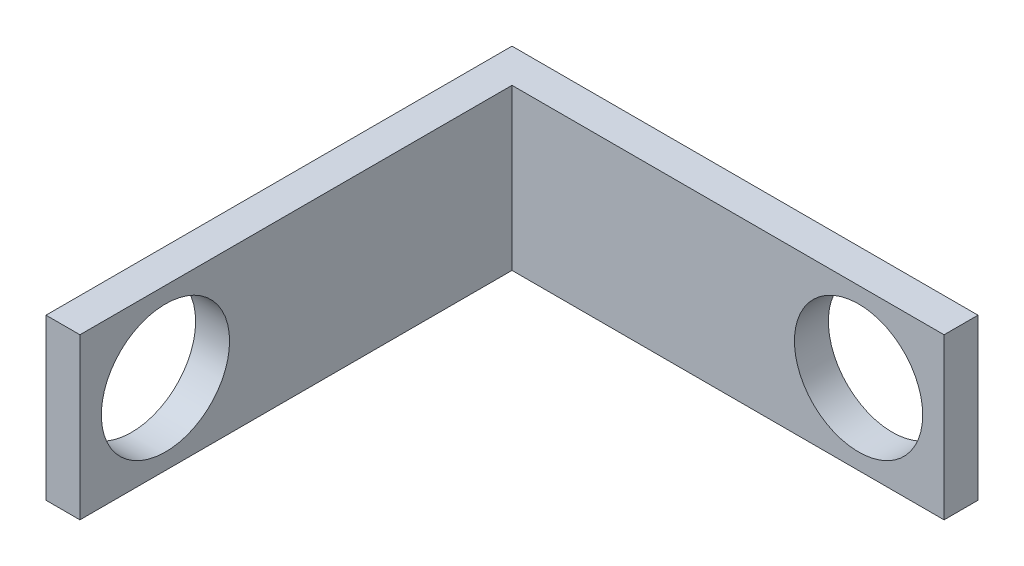
ISO-10303-21;
HEADER;
FILE_DESCRIPTION(('STEP AP214'),'2;1');
FILE_NAME('part.step','',(''),(''),'','','');
FILE_SCHEMA(('AUTOMOTIVE_DESIGN { 1 0 10303 214 1 1 1 1 }'));
ENDSEC;
DATA;
#1=APPLICATION_CONTEXT('core data for automotive mechanical design processes');
#2=APPLICATION_PROTOCOL_DEFINITION('international standard','automotive_design',2000,#1);
#3=PRODUCT_CONTEXT('',#1,'mechanical');
#4=PRODUCT('Part','Part','',(#3));
#5=PRODUCT_RELATED_PRODUCT_CATEGORY('part','',(#4));
#6=PRODUCT_DEFINITION_FORMATION('','',#4);
#7=PRODUCT_DEFINITION_CONTEXT('part definition',#1,'design');
#8=PRODUCT_DEFINITION('design','',#6,#7);
#9=PRODUCT_DEFINITION_SHAPE('','',#8);
#10=(LENGTH_UNIT() NAMED_UNIT(*) SI_UNIT(.MILLI.,.METRE.));
#11=(NAMED_UNIT(*) PLANE_ANGLE_UNIT() SI_UNIT($,.RADIAN.));
#12=(NAMED_UNIT(*) SI_UNIT($,.STERADIAN.) SOLID_ANGLE_UNIT());
#13=UNCERTAINTY_MEASURE_WITH_UNIT(LENGTH_MEASURE(1.E-05),#10,'distance_accuracy_value','');
#14=(GEOMETRIC_REPRESENTATION_CONTEXT(3) GLOBAL_UNCERTAINTY_ASSIGNED_CONTEXT((#13)) GLOBAL_UNIT_ASSIGNED_CONTEXT((#10,
#11,#12)) REPRESENTATION_CONTEXT('',''));
#15=CARTESIAN_POINT('',(0.,0.,0.));
#16=DIRECTION('',(0.,0.,1.));
#17=DIRECTION('',(1.,0.,0.));
#18=AXIS2_PLACEMENT_3D('',#15,#16,#17);
#19=CARTESIAN_POINT('',(0.,3.75,-17.8));
#20=DIRECTION('',(0.,0.,-1.));
#21=DIRECTION('',(-1.,0.,0.));
#22=AXIS2_PLACEMENT_3D('',#19,#20,#21);
#23=PLANE('',#22);
#24=CARTESIAN_POINT('',(0.,0.,-17.8));
#25=DIRECTION('',(0.,0.,1.));
#26=DIRECTION('',(1.,0.,0.));
#27=AXIS2_PLACEMENT_3D('',#24,#25,#26);
#28=CIRCLE('',#27,3.);
#29=CARTESIAN_POINT('',(3.,0.,-17.8));
#30=VERTEX_POINT('',#29);
#31=EDGE_CURVE('E134',#30,#30,#28,.T.);
#32=ORIENTED_EDGE('',*,*,#31,.T.);
#33=EDGE_LOOP('',(#32));
#34=FACE_BOUND('',#33,.T.);
#35=DIRECTION('',(1.,0.,0.));
#36=VECTOR('',#35,1.);
#37=CARTESIAN_POINT('',(0.,-3.75,-17.8));
#38=LINE('',#37,#36);
#39=CARTESIAN_POINT('',(-17.8,-3.75,-17.8));
#40=VERTEX_POINT('',#39);
#41=CARTESIAN_POINT('',(4.,-3.75,-17.8));
#42=VERTEX_POINT('',#41);
#43=EDGE_CURVE('E129',#40,#42,#38,.T.);
#44=ORIENTED_EDGE('',*,*,#43,.F.);
#45=DIRECTION('',(0.,-1.,0.));
#46=VECTOR('',#45,1.);
#47=CARTESIAN_POINT('',(-17.8,3.75,-17.8));
#48=LINE('',#47,#46);
#49=CARTESIAN_POINT('',(-17.8,3.75,-17.8));
#50=VERTEX_POINT('',#49);
#51=EDGE_CURVE('E11',#50,#40,#48,.T.);
#52=ORIENTED_EDGE('',*,*,#51,.F.);
#53=DIRECTION('',(1.,0.,0.));
#54=VECTOR('',#53,1.);
#55=CARTESIAN_POINT('',(0.,3.75,-17.8));
#56=LINE('',#55,#54);
#57=CARTESIAN_POINT('',(4.,3.75,-17.8));
#58=VERTEX_POINT('',#57);
#59=EDGE_CURVE('E149',#50,#58,#56,.T.);
#60=ORIENTED_EDGE('',*,*,#59,.T.);
#61=DIRECTION('',(0.,-1.,0.));
#62=VECTOR('',#61,1.);
#63=CARTESIAN_POINT('',(4.,3.75,-17.8));
#64=LINE('',#63,#62);
#65=EDGE_CURVE('E86',#58,#42,#64,.T.);
#66=ORIENTED_EDGE('',*,*,#65,.T.);
#67=EDGE_LOOP('',(#44,#52,#60,#66));
#68=FACE_BOUND('',#67,.T.);
#69=ADVANCED_FACE('F41',(#34,#68),#23,.T.);
#70=CARTESIAN_POINT('',(-17.8,3.75,0.));
#71=DIRECTION('',(-1.,0.,0.));
#72=DIRECTION('',(0.,0.,1.));
#73=AXIS2_PLACEMENT_3D('',#70,#71,#72);
#74=PLANE('',#73);
#75=CARTESIAN_POINT('',(-17.8,0.,0.));
#76=DIRECTION('',(1.,0.,0.));
#77=DIRECTION('',(0.,0.,-1.));
#78=AXIS2_PLACEMENT_3D('',#75,#76,#77);
#79=CIRCLE('',#78,3.);
#80=CARTESIAN_POINT('',(-17.8,0.,-3.));
#81=VERTEX_POINT('',#80);
#82=EDGE_CURVE('E176',#81,#81,#79,.T.);
#83=ORIENTED_EDGE('',*,*,#82,.T.);
#84=EDGE_LOOP('',(#83));
#85=FACE_BOUND('',#84,.T.);
#86=DIRECTION('',(0.,0.,-1.));
#87=VECTOR('',#86,1.);
#88=CARTESIAN_POINT('',(-17.8,-3.75,0.));
#89=LINE('',#88,#87);
#90=CARTESIAN_POINT('',(-17.8,-3.75,4.));
#91=VERTEX_POINT('',#90);
#92=EDGE_CURVE('E133',#91,#40,#89,.T.);
#93=ORIENTED_EDGE('',*,*,#92,.F.);
#94=DIRECTION('',(0.,-1.,0.));
#95=VECTOR('',#94,1.);
#96=CARTESIAN_POINT('',(-17.8,3.75,4.));
#97=LINE('',#96,#95);
#98=CARTESIAN_POINT('',(-17.8,3.75,4.));
#99=VERTEX_POINT('',#98);
#100=EDGE_CURVE('E50',#99,#91,#97,.T.);
#101=ORIENTED_EDGE('',*,*,#100,.F.);
#102=DIRECTION('',(0.,0.,-1.));
#103=VECTOR('',#102,1.);
#104=CARTESIAN_POINT('',(-17.8,3.75,0.));
#105=LINE('',#104,#103);
#106=EDGE_CURVE('E123',#99,#50,#105,.T.);
#107=ORIENTED_EDGE('',*,*,#106,.T.);
#108=ORIENTED_EDGE('',*,*,#51,.T.);
#109=EDGE_LOOP('',(#93,#101,#107,#108));
#110=FACE_BOUND('',#109,.T.);
#111=ADVANCED_FACE('F164',(#85,#110),#74,.T.);
#112=CARTESIAN_POINT('',(0.,3.75,4.));
#113=DIRECTION('',(0.,0.,-1.));
#114=DIRECTION('',(-1.,0.,0.));
#115=AXIS2_PLACEMENT_3D('',#112,#113,#114);
#116=PLANE('',#115);
#117=DIRECTION('',(1.,0.,0.));
#118=VECTOR('',#117,1.);
#119=CARTESIAN_POINT('',(0.,-3.75,4.));
#120=LINE('',#119,#118);
#121=CARTESIAN_POINT('',(-16.2125,-3.75,4.));
#122=VERTEX_POINT('',#121);
#123=EDGE_CURVE('E138',#91,#122,#120,.T.);
#124=ORIENTED_EDGE('',*,*,#123,.T.);
#125=DIRECTION('',(0.,-1.,0.));
#126=VECTOR('',#125,1.);
#127=CARTESIAN_POINT('',(-16.2125,3.75,4.));
#128=LINE('',#127,#126);
#129=CARTESIAN_POINT('',(-16.2125,3.75,4.));
#130=VERTEX_POINT('',#129);
#131=EDGE_CURVE('E108',#130,#122,#128,.T.);
#132=ORIENTED_EDGE('',*,*,#131,.F.);
#133=DIRECTION('',(1.,0.,0.));
#134=VECTOR('',#133,1.);
#135=CARTESIAN_POINT('',(0.,3.75,4.));
#136=LINE('',#135,#134);
#137=EDGE_CURVE('E118',#99,#130,#136,.T.);
#138=ORIENTED_EDGE('',*,*,#137,.F.);
#139=ORIENTED_EDGE('',*,*,#100,.T.);
#140=EDGE_LOOP('',(#124,#132,#138,#139));
#141=FACE_BOUND('',#140,.T.);
#142=ADVANCED_FACE('F158',(#141),#116,.F.);
#143=CARTESIAN_POINT('',(-16.2125,3.75,0.));
#144=DIRECTION('',(1.,0.,0.));
#145=DIRECTION('',(0.,0.,-1.));
#146=AXIS2_PLACEMENT_3D('',#143,#144,#145);
#147=PLANE('',#146);
#148=CARTESIAN_POINT('',(-16.2125,0.,0.));
#149=DIRECTION('',(1.,0.,0.));
#150=DIRECTION('',(0.,0.,-1.));
#151=AXIS2_PLACEMENT_3D('',#148,#149,#150);
#152=CIRCLE('',#151,3.);
#153=CARTESIAN_POINT('',(-16.2125,0.,-3.));
#154=VERTEX_POINT('',#153);
#155=EDGE_CURVE('E180',#154,#154,#152,.T.);
#156=ORIENTED_EDGE('',*,*,#155,.F.);
#157=EDGE_LOOP('',(#156));
#158=FACE_BOUND('',#157,.T.);
#159=DIRECTION('',(0.,0.,1.));
#160=VECTOR('',#159,1.);
#161=CARTESIAN_POINT('',(-16.2125,-3.75,0.));
#162=LINE('',#161,#160);
#163=CARTESIAN_POINT('',(-16.2125,-3.75,-16.2125));
#164=VERTEX_POINT('',#163);
#165=EDGE_CURVE('E106',#164,#122,#162,.T.);
#166=ORIENTED_EDGE('',*,*,#165,.F.);
#167=DIRECTION('',(0.,-1.,0.));
#168=VECTOR('',#167,1.);
#169=CARTESIAN_POINT('',(-16.2125,3.75,-16.2125));
#170=LINE('',#169,#168);
#171=CARTESIAN_POINT('',(-16.2125,3.75,-16.2125));
#172=VERTEX_POINT('',#171);
#173=EDGE_CURVE('E100',#172,#164,#170,.T.);
#174=ORIENTED_EDGE('',*,*,#173,.F.);
#175=DIRECTION('',(0.,0.,1.));
#176=VECTOR('',#175,1.);
#177=CARTESIAN_POINT('',(-16.2125,3.75,0.));
#178=LINE('',#177,#176);
#179=EDGE_CURVE('E104',#172,#130,#178,.T.);
#180=ORIENTED_EDGE('',*,*,#179,.T.);
#181=ORIENTED_EDGE('',*,*,#131,.T.);
#182=EDGE_LOOP('',(#166,#174,#180,#181));
#183=FACE_BOUND('',#182,.T.);
#184=ADVANCED_FACE('F102',(#158,#183),#147,.T.);
#185=CARTESIAN_POINT('',(0.,3.75,-16.2125));
#186=DIRECTION('',(0.,0.,-1.));
#187=DIRECTION('',(-1.,0.,0.));
#188=AXIS2_PLACEMENT_3D('',#185,#186,#187);
#189=PLANE('',#188);
#190=CARTESIAN_POINT('',(0.,0.,-16.2125));
#191=DIRECTION('',(0.,0.,1.));
#192=DIRECTION('',(1.,0.,0.));
#193=AXIS2_PLACEMENT_3D('',#190,#191,#192);
#194=CIRCLE('',#193,3.);
#195=CARTESIAN_POINT('',(3.,0.,-16.2125));
#196=VERTEX_POINT('',#195);
#197=EDGE_CURVE('E172',#196,#196,#194,.T.);
#198=ORIENTED_EDGE('',*,*,#197,.F.);
#199=EDGE_LOOP('',(#198));
#200=FACE_BOUND('',#199,.T.);
#201=DIRECTION('',(1.,0.,0.));
#202=VECTOR('',#201,1.);
#203=CARTESIAN_POINT('',(0.,-3.75,-16.2125));
#204=LINE('',#203,#202);
#205=CARTESIAN_POINT('',(4.,-3.75,-16.2125));
#206=VERTEX_POINT('',#205);
#207=EDGE_CURVE('E79',#164,#206,#204,.T.);
#208=ORIENTED_EDGE('',*,*,#207,.T.);
#209=DIRECTION('',(0.,-1.,0.));
#210=VECTOR('',#209,1.);
#211=CARTESIAN_POINT('',(4.,3.75,-16.2125));
#212=LINE('',#211,#210);
#213=CARTESIAN_POINT('',(4.,3.75,-16.2125));
#214=VERTEX_POINT('',#213);
#215=EDGE_CURVE('E109',#214,#206,#212,.T.);
#216=ORIENTED_EDGE('',*,*,#215,.F.);
#217=DIRECTION('',(1.,0.,0.));
#218=VECTOR('',#217,1.);
#219=CARTESIAN_POINT('',(0.,3.75,-16.2125));
#220=LINE('',#219,#218);
#221=EDGE_CURVE('E111',#172,#214,#220,.T.);
#222=ORIENTED_EDGE('',*,*,#221,.F.);
#223=ORIENTED_EDGE('',*,*,#173,.T.);
#224=EDGE_LOOP('',(#208,#216,#222,#223));
#225=FACE_BOUND('',#224,.T.);
#226=ADVANCED_FACE('F112',(#200,#225),#189,.F.);
#227=CARTESIAN_POINT('',(4.,3.75,0.));
#228=DIRECTION('',(-1.,0.,0.));
#229=DIRECTION('',(0.,0.,1.));
#230=AXIS2_PLACEMENT_3D('',#227,#228,#229);
#231=PLANE('',#230);
#232=DIRECTION('',(0.,0.,-1.));
#233=VECTOR('',#232,1.);
#234=CARTESIAN_POINT('',(4.,-3.75,0.));
#235=LINE('',#234,#233);
#236=EDGE_CURVE('E146',#206,#42,#235,.T.);
#237=ORIENTED_EDGE('',*,*,#236,.T.);
#238=ORIENTED_EDGE('',*,*,#65,.F.);
#239=DIRECTION('',(0.,0.,-1.));
#240=VECTOR('',#239,1.);
#241=CARTESIAN_POINT('',(4.,3.75,0.));
#242=LINE('',#241,#240);
#243=EDGE_CURVE('E58',#214,#58,#242,.T.);
#244=ORIENTED_EDGE('',*,*,#243,.F.);
#245=ORIENTED_EDGE('',*,*,#215,.T.);
#246=EDGE_LOOP('',(#237,#238,#244,#245));
#247=FACE_BOUND('',#246,.T.);
#248=ADVANCED_FACE('F167',(#247),#231,.F.);
#249=CARTESIAN_POINT('',(0.,3.75,0.));
#250=DIRECTION('',(0.,1.,0.));
#251=DIRECTION('',(0.,0.,1.));
#252=AXIS2_PLACEMENT_3D('',#249,#250,#251);
#253=PLANE('',#252);
#254=ORIENTED_EDGE('',*,*,#59,.F.);
#255=ORIENTED_EDGE('',*,*,#106,.F.);
#256=ORIENTED_EDGE('',*,*,#137,.T.);
#257=ORIENTED_EDGE('',*,*,#179,.F.);
#258=ORIENTED_EDGE('',*,*,#221,.T.);
#259=ORIENTED_EDGE('',*,*,#243,.T.);
#260=EDGE_LOOP('',(#254,#255,#256,#257,#258,#259));
#261=FACE_BOUND('',#260,.T.);
#262=ADVANCED_FACE('F115',(#261),#253,.T.);
#263=CARTESIAN_POINT('',(0.,-3.75,0.));
#264=DIRECTION('',(0.,1.,0.));
#265=DIRECTION('',(0.,0.,1.));
#266=AXIS2_PLACEMENT_3D('',#263,#264,#265);
#267=PLANE('',#266);
#268=ORIENTED_EDGE('',*,*,#43,.T.);
#269=ORIENTED_EDGE('',*,*,#236,.F.);
#270=ORIENTED_EDGE('',*,*,#207,.F.);
#271=ORIENTED_EDGE('',*,*,#165,.T.);
#272=ORIENTED_EDGE('',*,*,#123,.F.);
#273=ORIENTED_EDGE('',*,*,#92,.T.);
#274=EDGE_LOOP('',(#268,#269,#270,#271,#272,#273));
#275=FACE_BOUND('',#274,.T.);
#276=ADVANCED_FACE('F163',(#275),#267,.F.);
#277=CARTESIAN_POINT('',(0.,0.,-17.8));
#278=DIRECTION('',(0.,0.,1.));
#279=DIRECTION('',(1.,0.,0.));
#280=AXIS2_PLACEMENT_3D('',#277,#278,#279);
#281=CYLINDRICAL_SURFACE('',#280,3.);
#282=CARTESIAN_POINT('',(3.,0.,-17.8));
#283=CARTESIAN_POINT('',(3.,0.,-17.7834635416667));
#284=CARTESIAN_POINT('',(3.,0.,-17.7669270833333));
#285=CARTESIAN_POINT('',(3.,0.,-17.7338541666667));
#286=CARTESIAN_POINT('',(3.,0.,-17.7173177083333));
#287=CARTESIAN_POINT('',(3.,0.,-17.6842447916667));
#288=CARTESIAN_POINT('',(3.,0.,-17.6677083333333));
#289=CARTESIAN_POINT('',(3.,0.,-17.6346354166667));
#290=CARTESIAN_POINT('',(3.,0.,-17.6180989583333));
#291=CARTESIAN_POINT('',(3.,0.,-17.5850260416667));
#292=CARTESIAN_POINT('',(3.,0.,-17.5684895833333));
#293=CARTESIAN_POINT('',(3.,0.,-17.5354166666667));
#294=CARTESIAN_POINT('',(3.,0.,-17.5188802083333));
#295=CARTESIAN_POINT('',(3.,0.,-17.4858072916667));
#296=CARTESIAN_POINT('',(3.,0.,-17.4692708333333));
#297=CARTESIAN_POINT('',(3.,0.,-17.4361979166667));
#298=CARTESIAN_POINT('',(3.,0.,-17.4196614583333));
#299=CARTESIAN_POINT('',(3.,0.,-17.3865885416667));
#300=CARTESIAN_POINT('',(3.,0.,-17.3700520833333));
#301=CARTESIAN_POINT('',(3.,0.,-17.3369791666667));
#302=CARTESIAN_POINT('',(3.,0.,-17.3204427083333));
#303=CARTESIAN_POINT('',(3.,0.,-17.2873697916667));
#304=CARTESIAN_POINT('',(3.,0.,-17.2708333333333));
#305=CARTESIAN_POINT('',(3.,0.,-17.2377604166667));
#306=CARTESIAN_POINT('',(3.,0.,-17.2212239583333));
#307=CARTESIAN_POINT('',(3.,0.,-17.1881510416667));
#308=CARTESIAN_POINT('',(3.,0.,-17.1716145833333));
#309=CARTESIAN_POINT('',(3.,0.,-17.1385416666667));
#310=CARTESIAN_POINT('',(3.,0.,-17.1220052083333));
#311=CARTESIAN_POINT('',(3.,0.,-17.0889322916667));
#312=CARTESIAN_POINT('',(3.,0.,-17.0723958333333));
#313=CARTESIAN_POINT('',(3.,0.,-17.0393229166667));
#314=CARTESIAN_POINT('',(3.,0.,-17.0227864583333));
#315=CARTESIAN_POINT('',(3.,0.,-16.9897135416667));
#316=CARTESIAN_POINT('',(3.,0.,-16.9731770833333));
#317=CARTESIAN_POINT('',(3.,0.,-16.9401041666667));
#318=CARTESIAN_POINT('',(3.,0.,-16.9235677083333));
#319=CARTESIAN_POINT('',(3.,0.,-16.8904947916667));
#320=CARTESIAN_POINT('',(3.,0.,-16.8739583333333));
#321=CARTESIAN_POINT('',(3.,0.,-16.8408854166667));
#322=CARTESIAN_POINT('',(3.,0.,-16.8243489583333));
#323=CARTESIAN_POINT('',(3.,0.,-16.7912760416667));
#324=CARTESIAN_POINT('',(3.,0.,-16.7747395833333));
#325=CARTESIAN_POINT('',(3.,0.,-16.7416666666667));
#326=CARTESIAN_POINT('',(3.,0.,-16.7251302083333));
#327=CARTESIAN_POINT('',(3.,0.,-16.6920572916667));
#328=CARTESIAN_POINT('',(3.,0.,-16.6755208333333));
#329=CARTESIAN_POINT('',(3.,0.,-16.6424479166667));
#330=CARTESIAN_POINT('',(3.,0.,-16.6259114583333));
#331=CARTESIAN_POINT('',(3.,0.,-16.5928385416667));
#332=CARTESIAN_POINT('',(3.,0.,-16.5763020833333));
#333=CARTESIAN_POINT('',(3.,0.,-16.5432291666667));
#334=CARTESIAN_POINT('',(3.,0.,-16.5266927083333));
#335=CARTESIAN_POINT('',(3.,0.,-16.4936197916667));
#336=CARTESIAN_POINT('',(3.,0.,-16.4770833333333));
#337=CARTESIAN_POINT('',(3.,0.,-16.4440104166667));
#338=CARTESIAN_POINT('',(3.,0.,-16.4274739583333));
#339=CARTESIAN_POINT('',(3.,0.,-16.3944010416667));
#340=CARTESIAN_POINT('',(3.,0.,-16.3778645833333));
#341=CARTESIAN_POINT('',(3.,0.,-16.3447916666667));
#342=CARTESIAN_POINT('',(3.,0.,-16.3282552083333));
#343=CARTESIAN_POINT('',(3.,0.,-16.2951822916667));
#344=CARTESIAN_POINT('',(3.,0.,-16.2786458333333));
#345=CARTESIAN_POINT('',(3.,0.,-16.2455729166667));
#346=CARTESIAN_POINT('',(3.,0.,-16.2290364583333));
#347=CARTESIAN_POINT('',(3.,0.,-16.2125));
#348=B_SPLINE_CURVE_WITH_KNOTS('',3,(#282,#283,#284,#285,#286,#287,#288,#289,#290,#291,#292,
#293,#294,#295,#296,#297,#298,#299,#300,#301,#302,#303,#304,#305,#306,#307,#308,#309,#310,#311,
#312,#313,#314,#315,#316,#317,#318,#319,#320,#321,#322,#323,#324,#325,#326,#327,#328,#329,#330,
#331,#332,#333,#334,#335,#336,#337,#338,#339,#340,#341,#342,#343,#344,#345,#346,#347),
.UNSPECIFIED.,.F.,.F.,(4,2,2,2,2,2,2,2,2,2,2,2,2,2,2,2,2,2,2,2,2,2,2,2,2,2,2,2,2,2,2,2,4),(0.,
0.0496093749999989,0.0992187499999977,0.148828125,0.198437499999999,0.248046874999998,
0.29765625,0.347265624999999,0.396874999999998,0.446484375,0.496093749999999,0.545703124999998,
0.5953125,0.644921874999999,0.694531249999998,0.744140625,0.793749999999999,0.843359374999998,
0.892968750000001,0.942578124999999,0.992187499999998,1.041796875,1.09140625,1.141015625,
1.190625,1.240234375,1.28984375,1.339453125,1.3890625,1.438671875,1.48828125,1.537890625,
1.5875),.UNSPECIFIED.);
#349=EDGE_CURVE('BSEAM192',#30,#196,#348,.T.);
#350=ORIENTED_EDGE('',*,*,#31,.F.);
#351=ORIENTED_EDGE('',*,*,#197,.T.);
#352=ORIENTED_EDGE('',*,*,#349,.T.);
#353=ORIENTED_EDGE('',*,*,#349,.F.);
#354=EDGE_LOOP('',(#350,#352,#351,#353));
#355=FACE_BOUND('',#354,.T.);
#356=ADVANCED_FACE('F192',(#355),#281,.F.);
#357=CARTESIAN_POINT('',(-17.8,0.,0.));
#358=DIRECTION('',(1.,0.,0.));
#359=DIRECTION('',(0.,0.,-1.));
#360=AXIS2_PLACEMENT_3D('',#357,#358,#359);
#361=CYLINDRICAL_SURFACE('',#360,3.);
#362=ORIENTED_EDGE('',*,*,#82,.F.);
#363=EDGE_LOOP('',(#362));
#364=FACE_BOUND('',#363,.T.);
#365=ORIENTED_EDGE('',*,*,#155,.T.);
#366=EDGE_LOOP('',(#365));
#367=FACE_BOUND('',#366,.T.);
#368=ADVANCED_FACE('F189',(#364,#367),#361,.F.);
#369=CLOSED_SHELL('',(#69,#111,#142,#184,#226,#248,#262,#276,#356,#368));
#370=MANIFOLD_SOLID_BREP('B2',#369);
#371=ADVANCED_BREP_SHAPE_REPRESENTATION('',(#18,#370),#14);
#372=SHAPE_DEFINITION_REPRESENTATION(#9,#371);
ENDSEC;
END-ISO-10303-21;
